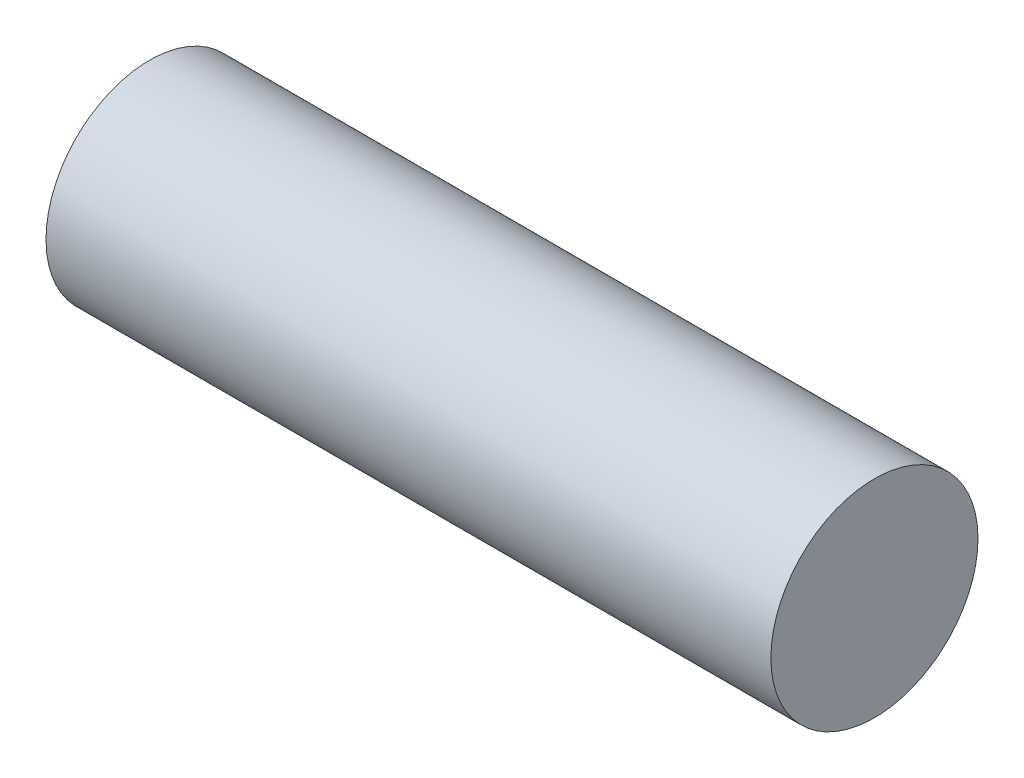
ISO-10303-21;
HEADER;
FILE_DESCRIPTION(('STEP AP214'),'2;1');
FILE_NAME('part.step','',(''),(''),'','','');
FILE_SCHEMA(('AUTOMOTIVE_DESIGN { 1 0 10303 214 1 1 1 1 }'));
ENDSEC;
DATA;
#1=APPLICATION_CONTEXT('core data for automotive mechanical design processes');
#2=APPLICATION_PROTOCOL_DEFINITION('international standard','automotive_design',2000,#1);
#3=PRODUCT_CONTEXT('',#1,'mechanical');
#4=PRODUCT('Part','Part','',(#3));
#5=PRODUCT_RELATED_PRODUCT_CATEGORY('part','',(#4));
#6=PRODUCT_DEFINITION_FORMATION('','',#4);
#7=PRODUCT_DEFINITION_CONTEXT('part definition',#1,'design');
#8=PRODUCT_DEFINITION('design','',#6,#7);
#9=PRODUCT_DEFINITION_SHAPE('','',#8);
#10=(LENGTH_UNIT() NAMED_UNIT(*) SI_UNIT(.MILLI.,.METRE.));
#11=(NAMED_UNIT(*) PLANE_ANGLE_UNIT() SI_UNIT($,.RADIAN.));
#12=(NAMED_UNIT(*) SI_UNIT($,.STERADIAN.) SOLID_ANGLE_UNIT());
#13=UNCERTAINTY_MEASURE_WITH_UNIT(LENGTH_MEASURE(1.E-05),#10,'distance_accuracy_value','');
#14=(GEOMETRIC_REPRESENTATION_CONTEXT(3) GLOBAL_UNCERTAINTY_ASSIGNED_CONTEXT((#13)) GLOBAL_UNIT_ASSIGNED_CONTEXT((#10,
#11,#12)) REPRESENTATION_CONTEXT('',''));
#15=CARTESIAN_POINT('',(0.,0.,0.));
#16=DIRECTION('',(0.,0.,1.));
#17=DIRECTION('',(1.,0.,0.));
#18=AXIS2_PLACEMENT_3D('',#15,#16,#17);
#19=CARTESIAN_POINT('',(7.,0.,0.));
#20=DIRECTION('',(-1.,0.,0.));
#21=DIRECTION('',(0.,0.,1.));
#22=AXIS2_PLACEMENT_3D('',#19,#20,#21);
#23=CYLINDRICAL_SURFACE('',#22,0.999999999999999);
#24=CARTESIAN_POINT('',(7.,0.,0.));
#25=DIRECTION('',(1.,0.,0.));
#26=DIRECTION('',(0.,0.,-1.));
#27=AXIS2_PLACEMENT_3D('',#24,#25,#26);
#28=CIRCLE('',#27,0.999999999999999);
#29=CARTESIAN_POINT('',(7.,0.,-0.999999999999999));
#30=VERTEX_POINT('',#29);
#31=EDGE_CURVE('E10',#30,#30,#28,.T.);
#32=ORIENTED_EDGE('',*,*,#31,.F.);
#33=EDGE_LOOP('',(#32));
#34=FACE_BOUND('',#33,.T.);
#35=CARTESIAN_POINT('',(0.,0.,0.));
#36=DIRECTION('',(1.,0.,0.));
#37=DIRECTION('',(0.,0.,-1.));
#38=AXIS2_PLACEMENT_3D('',#35,#36,#37);
#39=CIRCLE('',#38,0.999999999999999);
#40=CARTESIAN_POINT('',(0.,0.,-0.999999999999999));
#41=VERTEX_POINT('',#40);
#42=EDGE_CURVE('E38',#41,#41,#39,.T.);
#43=ORIENTED_EDGE('',*,*,#42,.T.);
#44=EDGE_LOOP('',(#43));
#45=FACE_BOUND('',#44,.T.);
#46=ADVANCED_FACE('F35',(#34,#45),#23,.T.);
#47=CARTESIAN_POINT('',(7.,0.,0.));
#48=DIRECTION('',(1.,0.,0.));
#49=DIRECTION('',(0.,0.,-1.));
#50=AXIS2_PLACEMENT_3D('',#47,#48,#49);
#51=PLANE('',#50);
#52=ORIENTED_EDGE('',*,*,#31,.T.);
#53=EDGE_LOOP('',(#52));
#54=FACE_BOUND('',#53,.T.);
#55=ADVANCED_FACE('F50',(#54),#51,.T.);
#56=CARTESIAN_POINT('',(0.,0.,0.));
#57=DIRECTION('',(1.,0.,0.));
#58=DIRECTION('',(0.,0.,-1.));
#59=AXIS2_PLACEMENT_3D('',#56,#57,#58);
#60=PLANE('',#59);
#61=ORIENTED_EDGE('',*,*,#42,.F.);
#62=EDGE_LOOP('',(#61));
#63=FACE_BOUND('',#62,.T.);
#64=ADVANCED_FACE('F48',(#63),#60,.F.);
#65=CLOSED_SHELL('',(#46,#55,#64));
#66=MANIFOLD_SOLID_BREP('B2',#65);
#67=ADVANCED_BREP_SHAPE_REPRESENTATION('',(#18,#66),#14);
#68=SHAPE_DEFINITION_REPRESENTATION(#9,#67);
ENDSEC;
END-ISO-10303-21;
